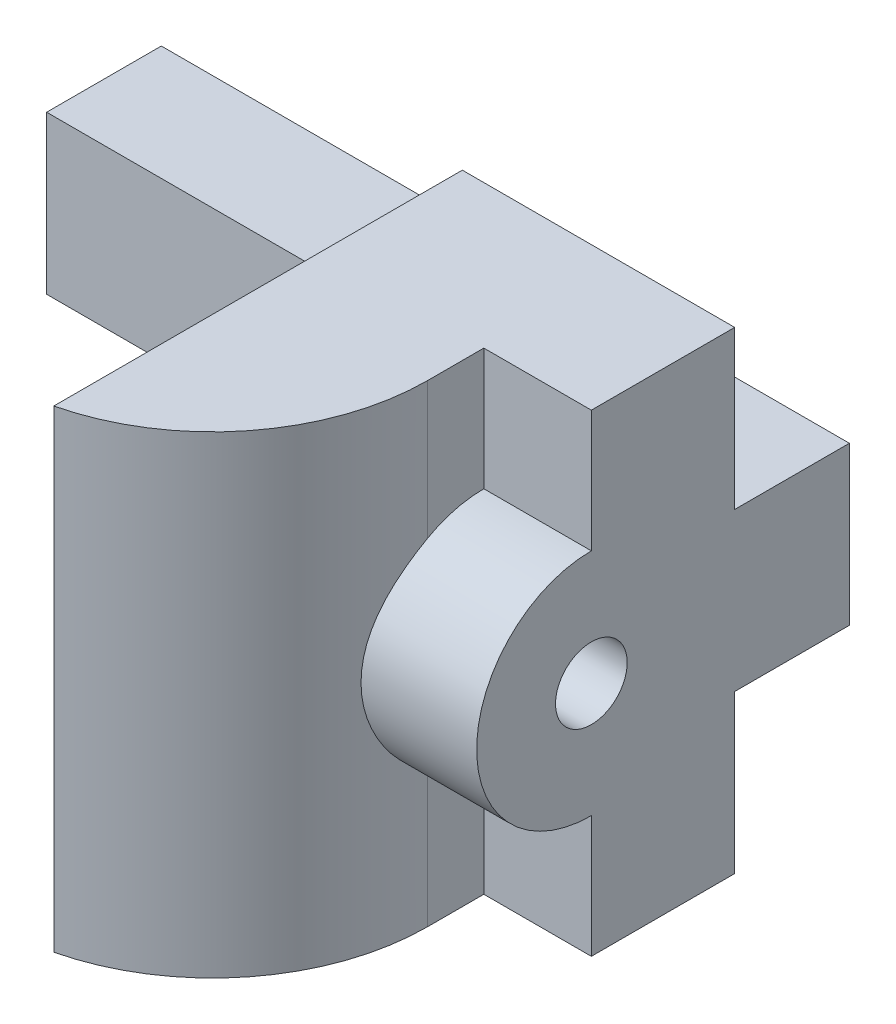
ISO-10303-21;
HEADER;
FILE_DESCRIPTION(('STEP AP214'),'2;1');
FILE_NAME('part.step','',(''),(''),'','','');
FILE_SCHEMA(('AUTOMOTIVE_DESIGN { 1 0 10303 214 1 1 1 1 }'));
ENDSEC;
DATA;
#1=APPLICATION_CONTEXT('core data for automotive mechanical design processes');
#2=APPLICATION_PROTOCOL_DEFINITION('international standard','automotive_design',2000,#1);
#3=PRODUCT_CONTEXT('',#1,'mechanical');
#4=PRODUCT('Part','Part','',(#3));
#5=PRODUCT_RELATED_PRODUCT_CATEGORY('part','',(#4));
#6=PRODUCT_DEFINITION_FORMATION('','',#4);
#7=PRODUCT_DEFINITION_CONTEXT('part definition',#1,'design');
#8=PRODUCT_DEFINITION('design','',#6,#7);
#9=PRODUCT_DEFINITION_SHAPE('','',#8);
#10=(LENGTH_UNIT() NAMED_UNIT(*) SI_UNIT(.MILLI.,.METRE.));
#11=(NAMED_UNIT(*) PLANE_ANGLE_UNIT() SI_UNIT($,.RADIAN.));
#12=(NAMED_UNIT(*) SI_UNIT($,.STERADIAN.) SOLID_ANGLE_UNIT());
#13=UNCERTAINTY_MEASURE_WITH_UNIT(LENGTH_MEASURE(1.E-05),#10,'distance_accuracy_value','');
#14=(GEOMETRIC_REPRESENTATION_CONTEXT(3) GLOBAL_UNCERTAINTY_ASSIGNED_CONTEXT((#13)) GLOBAL_UNIT_ASSIGNED_CONTEXT((#10,
#11,#12)) REPRESENTATION_CONTEXT('',''));
#15=CARTESIAN_POINT('',(0.,0.,0.));
#16=DIRECTION('',(0.,0.,1.));
#17=DIRECTION('',(1.,0.,0.));
#18=AXIS2_PLACEMENT_3D('',#15,#16,#17);
#19=CARTESIAN_POINT('',(-15.,-33.,37.));
#20=DIRECTION('',(1.,0.,0.));
#21=DIRECTION('',(0.,0.,-1.));
#22=AXIS2_PLACEMENT_3D('',#19,#20,#21);
#23=PLANE('',#22);
#24=DIRECTION('',(0.,0.,-1.));
#25=VECTOR('',#24,1.);
#26=CARTESIAN_POINT('',(-15.,33.,37.));
#27=LINE('',#26,#25);
#28=CARTESIAN_POINT('',(-15.,33.,7.82809570837035));
#29=VERTEX_POINT('',#28);
#30=CARTESIAN_POINT('',(-15.,33.,0.));
#31=VERTEX_POINT('',#30);
#32=EDGE_CURVE('E187',#29,#31,#27,.T.);
#33=ORIENTED_EDGE('',*,*,#32,.F.);
#34=DIRECTION('',(0.,1.,0.));
#35=VECTOR('',#34,1.);
#36=CARTESIAN_POINT('',(-15.,-33.,7.82809570837034));
#37=LINE('',#36,#35);
#38=CARTESIAN_POINT('',(-15.,13.9542437122402,7.82809570837034));
#39=VERTEX_POINT('',#38);
#40=EDGE_CURVE('E70',#29,#39,#37,.F.);
#41=ORIENTED_EDGE('',*,*,#40,.T.);
#42=CARTESIAN_POINT('',(-15.,0.,0.));
#43=DIRECTION('',(1.,0.,0.));
#44=DIRECTION('',(0.,0.,-1.));
#45=AXIS2_PLACEMENT_3D('',#42,#43,#44);
#46=CIRCLE('',#45,16.);
#47=CARTESIAN_POINT('',(-15.,16.,0.));
#48=VERTEX_POINT('',#47);
#49=EDGE_CURVE('E228',#48,#39,#46,.T.);
#50=ORIENTED_EDGE('',*,*,#49,.F.);
#51=DIRECTION('',(0.,1.,0.));
#52=VECTOR('',#51,1.);
#53=CARTESIAN_POINT('',(-15.,0.,0.));
#54=LINE('',#53,#52);
#55=EDGE_CURVE('E223',#48,#31,#54,.T.);
#56=ORIENTED_EDGE('',*,*,#55,.T.);
#57=EDGE_LOOP('',(#33,#41,#50,#56));
#58=FACE_BOUND('',#57,.T.);
#59=ADVANCED_FACE('F43',(#58),#23,.T.);
#60=CARTESIAN_POINT('',(-15.,0.,-20.));
#61=DIRECTION('',(0.,0.,1.));
#62=DIRECTION('',(1.,0.,0.));
#63=AXIS2_PLACEMENT_3D('',#60,#61,#62);
#64=PLANE('',#63);
#65=DIRECTION('',(1.,0.,0.));
#66=VECTOR('',#65,1.);
#67=CARTESIAN_POINT('',(-96.,11.,-20.));
#68=LINE('',#67,#66);
#69=CARTESIAN_POINT('',(-38.,11.,-20.));
#70=VERTEX_POINT('',#69);
#71=CARTESIAN_POINT('',(0.,11.,-20.));
#72=VERTEX_POINT('',#71);
#73=EDGE_CURVE('E215',#70,#72,#68,.T.);
#74=ORIENTED_EDGE('',*,*,#73,.F.);
#75=DIRECTION('',(0.,1.,0.));
#76=VECTOR('',#75,1.);
#77=CARTESIAN_POINT('',(-38.,-33.,-20.));
#78=LINE('',#77,#76);
#79=CARTESIAN_POINT('',(-38.,33.,-20.));
#80=VERTEX_POINT('',#79);
#81=EDGE_CURVE('E176',#70,#80,#78,.T.);
#82=ORIENTED_EDGE('',*,*,#81,.T.);
#83=DIRECTION('',(1.,0.,0.));
#84=VECTOR('',#83,1.);
#85=CARTESIAN_POINT('',(-15.,33.,-20.));
#86=LINE('',#85,#84);
#87=CARTESIAN_POINT('',(0.,33.,-20.));
#88=VERTEX_POINT('',#87);
#89=EDGE_CURVE('E160',#80,#88,#86,.T.);
#90=ORIENTED_EDGE('',*,*,#89,.T.);
#91=DIRECTION('',(0.,-1.,0.));
#92=VECTOR('',#91,1.);
#93=CARTESIAN_POINT('',(0.,0.,-20.));
#94=LINE('',#93,#92);
#95=EDGE_CURVE('E247',#88,#72,#94,.T.);
#96=ORIENTED_EDGE('',*,*,#95,.T.);
#97=EDGE_LOOP('',(#74,#82,#90,#96));
#98=FACE_BOUND('',#97,.T.);
#99=ADVANCED_FACE('F275',(#98),#64,.F.);
#100=CARTESIAN_POINT('',(-15.,0.,0.));
#101=DIRECTION('',(0.,0.,-1.));
#102=DIRECTION('',(0.,1.,0.));
#103=AXIS2_PLACEMENT_3D('',#100,#101,#102);
#104=PLANE('',#103);
#105=DIRECTION('',(0.,1.,0.));
#106=VECTOR('',#105,1.);
#107=CARTESIAN_POINT('',(0.,0.,0.));
#108=LINE('',#107,#106);
#109=CARTESIAN_POINT('',(0.,16.,0.));
#110=VERTEX_POINT('',#109);
#111=CARTESIAN_POINT('',(0.,33.,0.));
#112=VERTEX_POINT('',#111);
#113=EDGE_CURVE('E236',#110,#112,#108,.T.);
#114=ORIENTED_EDGE('',*,*,#113,.T.);
#115=DIRECTION('',(1.,0.,0.));
#116=VECTOR('',#115,1.);
#117=CARTESIAN_POINT('',(-15.,33.,0.));
#118=LINE('',#117,#116);
#119=EDGE_CURVE('E252',#31,#112,#118,.T.);
#120=ORIENTED_EDGE('',*,*,#119,.F.);
#121=ORIENTED_EDGE('',*,*,#55,.F.);
#122=DIRECTION('',(1.,0.,0.));
#123=VECTOR('',#122,1.);
#124=CARTESIAN_POINT('',(-15.,16.,0.));
#125=LINE('',#124,#123);
#126=EDGE_CURVE('E233',#48,#110,#125,.T.);
#127=ORIENTED_EDGE('',*,*,#126,.T.);
#128=EDGE_LOOP('',(#114,#120,#121,#127));
#129=FACE_BOUND('',#128,.T.);
#130=ADVANCED_FACE('F306',(#129),#104,.F.);
#131=CARTESIAN_POINT('',(-15.,33.,0.));
#132=DIRECTION('',(0.,1.,0.));
#133=DIRECTION('',(0.,0.,1.));
#134=AXIS2_PLACEMENT_3D('',#131,#132,#133);
#135=PLANE('',#134);
#136=DIRECTION('',(0.,0.,1.));
#137=VECTOR('',#136,1.);
#138=CARTESIAN_POINT('',(-38.,33.,37.));
#139=LINE('',#138,#137);
#140=CARTESIAN_POINT('',(-38.,33.,37.));
#141=VERTEX_POINT('',#140);
#142=EDGE_CURVE('E183',#80,#141,#139,.T.);
#143=ORIENTED_EDGE('',*,*,#142,.T.);
#144=CARTESIAN_POINT('',(-45.,33.,7.82809570837034));
#145=DIRECTION('',(0.,1.,0.));
#146=DIRECTION('',(0.,0.,1.));
#147=AXIS2_PLACEMENT_3D('',#144,#145,#146);
#148=CIRCLE('',#147,30.);
#149=EDGE_CURVE('E260',#141,#29,#148,.T.);
#150=ORIENTED_EDGE('',*,*,#149,.T.);
#151=ORIENTED_EDGE('',*,*,#32,.T.);
#152=ORIENTED_EDGE('',*,*,#119,.T.);
#153=DIRECTION('',(0.,0.,1.));
#154=VECTOR('',#153,1.);
#155=CARTESIAN_POINT('',(0.,33.,0.));
#156=LINE('',#155,#154);
#157=EDGE_CURVE('E227',#88,#112,#156,.T.);
#158=ORIENTED_EDGE('',*,*,#157,.F.);
#159=ORIENTED_EDGE('',*,*,#89,.F.);
#160=EDGE_LOOP('',(#143,#150,#151,#152,#158,#159));
#161=FACE_BOUND('',#160,.T.);
#162=ADVANCED_FACE('F271',(#161),#135,.T.);
#163=DIRECTION('',(1.,0.,0.));
#164=VECTOR('',#163,1.);
#165=CARTESIAN_POINT('',(-15.,-33.,-20.));
#166=LINE('',#165,#164);
#167=CARTESIAN_POINT('',(-38.,-33.,-20.));
#168=VERTEX_POINT('',#167);
#169=CARTESIAN_POINT('',(0.,-33.,-20.));
#170=VERTEX_POINT('',#169);
#171=EDGE_CURVE('E150',#168,#170,#166,.T.);
#172=ORIENTED_EDGE('',*,*,#171,.F.);
#173=CARTESIAN_POINT('',(-38.,-11.,-20.));
#174=VERTEX_POINT('',#173);
#175=EDGE_CURVE('E154',#168,#174,#78,.T.);
#176=ORIENTED_EDGE('',*,*,#175,.T.);
#177=DIRECTION('',(1.,0.,0.));
#178=VECTOR('',#177,1.);
#179=CARTESIAN_POINT('',(-96.,-11.,-20.));
#180=LINE('',#179,#178);
#181=CARTESIAN_POINT('',(0.,-11.,-20.));
#182=VERTEX_POINT('',#181);
#183=EDGE_CURVE('E222',#174,#182,#180,.T.);
#184=ORIENTED_EDGE('',*,*,#183,.T.);
#185=EDGE_CURVE('E156',#182,#170,#94,.T.);
#186=ORIENTED_EDGE('',*,*,#185,.T.);
#187=EDGE_LOOP('',(#172,#176,#184,#186));
#188=FACE_BOUND('',#187,.T.);
#189=ADVANCED_FACE('F152',(#188),#64,.F.);
#190=CARTESIAN_POINT('',(-15.,-33.,0.));
#191=DIRECTION('',(0.,1.,0.));
#192=DIRECTION('',(0.,0.,1.));
#193=AXIS2_PLACEMENT_3D('',#190,#191,#192);
#194=PLANE('',#193);
#195=DIRECTION('',(0.,0.,-1.));
#196=VECTOR('',#195,1.);
#197=CARTESIAN_POINT('',(-15.,-33.,37.));
#198=LINE('',#197,#196);
#199=CARTESIAN_POINT('',(-15.,-33.,7.82809570837034));
#200=VERTEX_POINT('',#199);
#201=CARTESIAN_POINT('',(-15.,-33.,0.));
#202=VERTEX_POINT('',#201);
#203=EDGE_CURVE('E180',#200,#202,#198,.T.);
#204=ORIENTED_EDGE('',*,*,#203,.F.);
#205=CARTESIAN_POINT('',(-45.,-33.,7.82809570837034));
#206=DIRECTION('',(0.,1.,0.));
#207=DIRECTION('',(0.,0.,1.));
#208=AXIS2_PLACEMENT_3D('',#205,#206,#207);
#209=CIRCLE('',#208,30.);
#210=CARTESIAN_POINT('',(-38.,-33.,37.));
#211=VERTEX_POINT('',#210);
#212=EDGE_CURVE('E57',#200,#211,#209,.F.);
#213=ORIENTED_EDGE('',*,*,#212,.T.);
#214=DIRECTION('',(0.,0.,1.));
#215=VECTOR('',#214,1.);
#216=CARTESIAN_POINT('',(-38.,-33.,37.));
#217=LINE('',#216,#215);
#218=EDGE_CURVE('E169',#168,#211,#217,.T.);
#219=ORIENTED_EDGE('',*,*,#218,.F.);
#220=ORIENTED_EDGE('',*,*,#171,.T.);
#221=DIRECTION('',(0.,0.,1.));
#222=VECTOR('',#221,1.);
#223=CARTESIAN_POINT('',(0.,-33.,0.));
#224=LINE('',#223,#222);
#225=CARTESIAN_POINT('',(0.,-33.,0.));
#226=VERTEX_POINT('',#225);
#227=EDGE_CURVE('E245',#170,#226,#224,.T.);
#228=ORIENTED_EDGE('',*,*,#227,.T.);
#229=DIRECTION('',(1.,0.,0.));
#230=VECTOR('',#229,1.);
#231=CARTESIAN_POINT('',(-15.,-33.,0.));
#232=LINE('',#231,#230);
#233=EDGE_CURVE('E161',#202,#226,#232,.T.);
#234=ORIENTED_EDGE('',*,*,#233,.F.);
#235=EDGE_LOOP('',(#204,#213,#219,#220,#228,#234));
#236=FACE_BOUND('',#235,.T.);
#237=ADVANCED_FACE('F178',(#236),#194,.F.);
#238=CARTESIAN_POINT('',(-15.,0.,0.));
#239=DIRECTION('',(0.,0.,-1.));
#240=DIRECTION('',(0.,1.,0.));
#241=AXIS2_PLACEMENT_3D('',#238,#239,#240);
#242=PLANE('',#241);
#243=DIRECTION('',(0.,1.,0.));
#244=VECTOR('',#243,1.);
#245=CARTESIAN_POINT('',(0.,0.,0.));
#246=LINE('',#245,#244);
#247=CARTESIAN_POINT('',(0.,-16.,0.));
#248=VERTEX_POINT('',#247);
#249=EDGE_CURVE('E242',#226,#248,#246,.T.);
#250=ORIENTED_EDGE('',*,*,#249,.T.);
#251=DIRECTION('',(1.,0.,0.));
#252=VECTOR('',#251,1.);
#253=CARTESIAN_POINT('',(-15.,-16.,0.));
#254=LINE('',#253,#252);
#255=CARTESIAN_POINT('',(-15.,-16.,0.));
#256=VERTEX_POINT('',#255);
#257=EDGE_CURVE('E257',#256,#248,#254,.T.);
#258=ORIENTED_EDGE('',*,*,#257,.F.);
#259=DIRECTION('',(0.,1.,0.));
#260=VECTOR('',#259,1.);
#261=CARTESIAN_POINT('',(-15.,0.,0.));
#262=LINE('',#261,#260);
#263=EDGE_CURVE('E230',#202,#256,#262,.T.);
#264=ORIENTED_EDGE('',*,*,#263,.F.);
#265=ORIENTED_EDGE('',*,*,#233,.T.);
#266=EDGE_LOOP('',(#250,#258,#264,#265));
#267=FACE_BOUND('',#266,.T.);
#268=ADVANCED_FACE('F299',(#267),#242,.F.);
#269=CARTESIAN_POINT('',(-15.,0.,0.));
#270=DIRECTION('',(1.,0.,0.));
#271=DIRECTION('',(0.,0.,-1.));
#272=AXIS2_PLACEMENT_3D('',#269,#270,#271);
#273=CYLINDRICAL_SURFACE('',#272,5.);
#274=CARTESIAN_POINT('',(0.,0.,0.));
#275=DIRECTION('',(1.,0.,0.));
#276=DIRECTION('',(0.,0.,-1.));
#277=AXIS2_PLACEMENT_3D('',#274,#275,#276);
#278=CIRCLE('',#277,5.);
#279=CARTESIAN_POINT('',(0.,0.,-5.));
#280=VERTEX_POINT('',#279);
#281=EDGE_CURVE('E213',#280,#280,#278,.T.);
#282=ORIENTED_EDGE('',*,*,#281,.T.);
#283=EDGE_LOOP('',(#282));
#284=FACE_BOUND('',#283,.T.);
#285=CARTESIAN_POINT('',(-38.,0.,0.));
#286=DIRECTION('',(-1.,0.,0.));
#287=DIRECTION('',(0.,0.,1.));
#288=AXIS2_PLACEMENT_3D('',#285,#286,#287);
#289=CIRCLE('',#288,5.);
#290=CARTESIAN_POINT('',(-38.,0.,5.));
#291=VERTEX_POINT('',#290);
#292=EDGE_CURVE('E189',#291,#291,#289,.T.);
#293=ORIENTED_EDGE('',*,*,#292,.T.);
#294=EDGE_LOOP('',(#293));
#295=FACE_BOUND('',#294,.T.);
#296=ADVANCED_FACE('F331',(#284,#295),#273,.F.);
#297=CARTESIAN_POINT('',(-15.,0.,0.));
#298=DIRECTION('',(1.,0.,0.));
#299=DIRECTION('',(0.,0.,-1.));
#300=AXIS2_PLACEMENT_3D('',#297,#298,#299);
#301=CYLINDRICAL_SURFACE('',#300,16.);
#302=CARTESIAN_POINT('',(0.,0.,0.));
#303=DIRECTION('',(1.,0.,0.));
#304=DIRECTION('',(0.,0.,-1.));
#305=AXIS2_PLACEMENT_3D('',#302,#303,#304);
#306=CIRCLE('',#305,16.);
#307=EDGE_CURVE('E239',#110,#248,#306,.T.);
#308=ORIENTED_EDGE('',*,*,#307,.F.);
#309=ORIENTED_EDGE('',*,*,#126,.F.);
#310=ORIENTED_EDGE('',*,*,#49,.T.);
#311=CARTESIAN_POINT('',(-15.,13.9542437122402,7.82809570837034));
#312=CARTESIAN_POINT('',(-14.9999984707289,13.8458238511641,8.02136495368062));
#313=CARTESIAN_POINT('',(-15.0018680134799,13.733402796322,8.21235183654159));
#314=CARTESIAN_POINT('',(-15.0090695703628,13.500765744661,8.58943568386215));
#315=CARTESIAN_POINT('',(-15.014401375906,13.3805502178233,8.77553294220114));
#316=CARTESIAN_POINT('',(-15.0351616882772,13.008671163494,9.32578786089453));
#317=CARTESIAN_POINT('',(-15.0553558509831,12.7456273641378,9.68217199285267));
#318=CARTESIAN_POINT('',(-15.1059511827228,12.1919389820572,10.3707027430823));
#319=CARTESIAN_POINT('',(-15.1363311087452,11.9013527380745,10.7028980678195));
#320=CARTESIAN_POINT('',(-15.2047462321411,11.2941539129909,11.3417945178719));
#321=CARTESIAN_POINT('',(-15.2427821993743,10.977538716422,11.6484930749516));
#322=CARTESIAN_POINT('',(-15.3238394499886,10.3208690446969,12.2340911041424));
#323=CARTESIAN_POINT('',(-15.3668547053921,9.98084310887267,12.5130234446041));
#324=CARTESIAN_POINT('',(-15.4553066944847,9.27921143915049,13.0418253870234));
#325=CARTESIAN_POINT('',(-15.5007433728901,8.91760619790962,13.2916956520866));
#326=CARTESIAN_POINT('',(-15.5915259734509,8.17491045641195,13.7609543928187));
#327=CARTESIAN_POINT('',(-15.6368718511583,7.79381208802574,13.9803304249604));
#328=CARTESIAN_POINT('',(-15.7250457999588,7.01461651305621,14.3870882515202));
#329=CARTESIAN_POINT('',(-15.7678738232731,6.61651898414383,14.5744694389321));
#330=CARTESIAN_POINT('',(-15.8499283735667,5.79442469512369,14.9207611709347));
#331=CARTESIAN_POINT('',(-15.8890199066429,5.37001452342851,15.0787238984434));
#332=CARTESIAN_POINT('',(-15.9600695824115,4.50877403780745,15.358252570357));
#333=CARTESIAN_POINT('',(-15.9920276053099,4.07194351544385,15.4798179035474));
#334=CARTESIAN_POINT('',(-16.0470627450896,3.18912142650823,15.6854983298854));
#335=CARTESIAN_POINT('',(-16.0701423387051,2.74313245140836,15.7696238682984));
#336=CARTESIAN_POINT('',(-16.1061677167384,1.84522189473494,15.8997146848741));
#337=CARTESIAN_POINT('',(-16.1191138524598,1.39330051937631,15.9456812859223));
#338=CARTESIAN_POINT('',(-16.1339474240853,0.499909647277765,15.9982683985053));
#339=CARTESIAN_POINT('',(-16.1361390236977,0.0585086139067362,16.0059711802765));
#340=CARTESIAN_POINT('',(-16.1301736423245,-0.823345933395908,15.9848872620183));
#341=CARTESIAN_POINT('',(-16.1220168311207,-1.26379946275405,15.9561011606461));
#342=CARTESIAN_POINT('',(-16.0957806016024,-2.14050128433078,15.8623013200419));
#343=CARTESIAN_POINT('',(-16.0777017264195,-2.57674980540061,15.7972895637911));
#344=CARTESIAN_POINT('',(-16.0325594388389,-3.44194109161932,15.6316041470315));
#345=CARTESIAN_POINT('',(-16.0054960103089,-3.87088384364882,15.5309304224897));
#346=CARTESIAN_POINT('',(-15.9442008902673,-4.71270873934569,15.2963622585319));
#347=CARTESIAN_POINT('',(-15.9100720686125,-5.12573017792261,15.1629399511382));
#348=CARTESIAN_POINT('',(-15.8361331881991,-5.93912261824279,14.8631992045905));
#349=CARTESIAN_POINT('',(-15.7963231524188,-6.33949367114434,14.6968808984879));
#350=CARTESIAN_POINT('',(-15.7129841642075,-7.12535938497216,14.332375589738));
#351=CARTESIAN_POINT('',(-15.669452857653,-7.51084440161166,14.1341683427641));
#352=CARTESIAN_POINT('',(-15.580903184057,-8.26433817599383,13.707232747038));
#353=CARTESIAN_POINT('',(-15.535884815973,-8.63234692148408,13.4785043768881));
#354=CARTESIAN_POINT('',(-15.4450708499839,-9.36194868142332,12.9828935805831));
#355=CARTESIAN_POINT('',(-15.3993081512006,-9.72280016103391,12.7149123634815));
#356=CARTESIAN_POINT('',(-15.3114664468623,-10.4209499725334,12.149305511944));
#357=CARTESIAN_POINT('',(-15.2693873792038,-10.7582487014856,11.8516803774645));
#358=CARTESIAN_POINT('',(-15.1917641852138,-11.4064631222209,11.2291677496947));
#359=CARTESIAN_POINT('',(-15.1562098107414,-11.7174197678152,10.9043241971919));
#360=CARTESIAN_POINT('',(-15.09432730019,-12.3111504495216,10.2292465709672));
#361=CARTESIAN_POINT('',(-15.0679943623297,-12.5939390981977,9.87902582665631));
#362=CARTESIAN_POINT('',(-15.032386010178,-13.0611654930808,9.24762314238053));
#363=CARTESIAN_POINT('',(-15.0204756434194,-13.2523246759277,8.97153691769578));
#364=CARTESIAN_POINT('',(-15.0042807258008,-13.6167907375265,8.4080671269403));
#365=CARTESIAN_POINT('',(-14.9999873493714,-13.7901180577594,8.12069703045202));
#366=CARTESIAN_POINT('',(-15.,-13.9542437122402,7.82809570837034));
#367=B_SPLINE_CURVE_WITH_KNOTS('',3,(#311,#312,#313,#314,#315,#316,#317,#318,#319,#320,#321,
#322,#323,#324,#325,#326,#327,#328,#329,#330,#331,#332,#333,#334,#335,#336,#337,#338,#339,#340,
#341,#342,#343,#344,#345,#346,#347,#348,#349,#350,#351,#352,#353,#354,#355,#356,#357,#358,#359,
#360,#361,#362,#363,#364,#365,#366),.UNSPECIFIED.,.F.,.F.,(4,2,2,2,2,2,2,2,2,2,2,2,2,2,2,2,2,2,
2,2,2,2,2,2,2,2,2,4),(0.,0.664690059223715,1.32934007700383,2.65773739085605,3.98338131062384,
5.30915859830797,6.63334734900669,7.95750587993959,9.28220317286547,10.6069255951612,
11.9688670776813,13.3308314297453,14.6924155711058,16.0539525074016,17.3767507719833,
18.6995273342689,20.0222314952872,21.3449380313093,22.6495928781606,23.9542424482969,
25.259723552234,26.5652055714159,27.9190039571072,29.2727795143229,30.6244101893403,
31.9753359937345,32.9826713823565,33.9888388386991),.UNSPECIFIED.);
#368=CARTESIAN_POINT('',(-15.,-13.9542437122402,7.82809570837034));
#369=VERTEX_POINT('',#368);
#370=EDGE_CURVE('E11',#39,#369,#367,.T.);
#371=ORIENTED_EDGE('',*,*,#370,.T.);
#372=EDGE_CURVE('E226',#369,#256,#46,.T.);
#373=ORIENTED_EDGE('',*,*,#372,.T.);
#374=ORIENTED_EDGE('',*,*,#257,.T.);
#375=EDGE_LOOP('',(#308,#309,#310,#371,#373,#374));
#376=FACE_BOUND('',#375,.T.);
#377=ADVANCED_FACE('F302',(#376),#301,.T.);
#378=CARTESIAN_POINT('',(0.,0.,0.));
#379=DIRECTION('',(1.,0.,0.));
#380=DIRECTION('',(0.,0.,-1.));
#381=AXIS2_PLACEMENT_3D('',#378,#379,#380);
#382=PLANE('',#381);
#383=ORIENTED_EDGE('',*,*,#281,.F.);
#384=EDGE_LOOP('',(#383));
#385=FACE_BOUND('',#384,.T.);
#386=ORIENTED_EDGE('',*,*,#113,.F.);
#387=ORIENTED_EDGE('',*,*,#307,.T.);
#388=ORIENTED_EDGE('',*,*,#249,.F.);
#389=ORIENTED_EDGE('',*,*,#227,.F.);
#390=ORIENTED_EDGE('',*,*,#185,.F.);
#391=DIRECTION('',(0.,0.,1.));
#392=VECTOR('',#391,1.);
#393=CARTESIAN_POINT('',(0.,-11.,0.));
#394=LINE('',#393,#392);
#395=CARTESIAN_POINT('',(0.,-11.,-36.));
#396=VERTEX_POINT('',#395);
#397=EDGE_CURVE('E192',#396,#182,#394,.T.);
#398=ORIENTED_EDGE('',*,*,#397,.F.);
#399=DIRECTION('',(0.,-1.,0.));
#400=VECTOR('',#399,1.);
#401=CARTESIAN_POINT('',(0.,0.,-36.));
#402=LINE('',#401,#400);
#403=CARTESIAN_POINT('',(0.,11.,-36.));
#404=VERTEX_POINT('',#403);
#405=EDGE_CURVE('E206',#404,#396,#402,.T.);
#406=ORIENTED_EDGE('',*,*,#405,.F.);
#407=DIRECTION('',(0.,0.,1.));
#408=VECTOR('',#407,1.);
#409=CARTESIAN_POINT('',(0.,11.,0.));
#410=LINE('',#409,#408);
#411=EDGE_CURVE('E197',#404,#72,#410,.T.);
#412=ORIENTED_EDGE('',*,*,#411,.T.);
#413=ORIENTED_EDGE('',*,*,#95,.F.);
#414=ORIENTED_EDGE('',*,*,#157,.T.);
#415=EDGE_LOOP('',(#386,#387,#388,#389,#390,#398,#406,#412,#413,#414));
#416=FACE_BOUND('',#415,.T.);
#417=ADVANCED_FACE('F295',(#385,#416),#382,.T.);
#418=CARTESIAN_POINT('',(-96.,0.,-20.));
#419=DIRECTION('',(0.,0.,-1.));
#420=DIRECTION('',(-1.,0.,0.));
#421=AXIS2_PLACEMENT_3D('',#418,#419,#420);
#422=PLANE('',#421);
#423=CARTESIAN_POINT('',(-96.,-11.,-20.));
#424=VERTEX_POINT('',#423);
#425=EDGE_CURVE('E204',#424,#174,#180,.T.);
#426=ORIENTED_EDGE('',*,*,#425,.T.);
#427=EDGE_CURVE('E173',#174,#70,#78,.T.);
#428=ORIENTED_EDGE('',*,*,#427,.T.);
#429=CARTESIAN_POINT('',(-96.,11.,-20.));
#430=VERTEX_POINT('',#429);
#431=EDGE_CURVE('E210',#430,#70,#68,.T.);
#432=ORIENTED_EDGE('',*,*,#431,.F.);
#433=DIRECTION('',(0.,1.,0.));
#434=VECTOR('',#433,1.);
#435=CARTESIAN_POINT('',(-96.,0.,-20.));
#436=LINE('',#435,#434);
#437=EDGE_CURVE('E194',#424,#430,#436,.T.);
#438=ORIENTED_EDGE('',*,*,#437,.F.);
#439=EDGE_LOOP('',(#426,#428,#432,#438));
#440=FACE_BOUND('',#439,.T.);
#441=ADVANCED_FACE('F280',(#440),#422,.F.);
#442=CARTESIAN_POINT('',(-96.,11.,0.));
#443=DIRECTION('',(0.,1.,0.));
#444=DIRECTION('',(0.,0.,1.));
#445=AXIS2_PLACEMENT_3D('',#442,#443,#444);
#446=PLANE('',#445);
#447=ORIENTED_EDGE('',*,*,#411,.F.);
#448=DIRECTION('',(1.,0.,0.));
#449=VECTOR('',#448,1.);
#450=CARTESIAN_POINT('',(-96.,11.,-36.));
#451=LINE('',#450,#449);
#452=CARTESIAN_POINT('',(-96.,11.,-36.));
#453=VERTEX_POINT('',#452);
#454=EDGE_CURVE('E214',#453,#404,#451,.T.);
#455=ORIENTED_EDGE('',*,*,#454,.F.);
#456=DIRECTION('',(0.,0.,1.));
#457=VECTOR('',#456,1.);
#458=CARTESIAN_POINT('',(-96.,11.,0.));
#459=LINE('',#458,#457);
#460=EDGE_CURVE('E201',#453,#430,#459,.T.);
#461=ORIENTED_EDGE('',*,*,#460,.T.);
#462=ORIENTED_EDGE('',*,*,#431,.T.);
#463=ORIENTED_EDGE('',*,*,#73,.T.);
#464=EDGE_LOOP('',(#447,#455,#461,#462,#463));
#465=FACE_BOUND('',#464,.T.);
#466=ADVANCED_FACE('F283',(#465),#446,.T.);
#467=CARTESIAN_POINT('',(-96.,0.,-36.));
#468=DIRECTION('',(0.,0.,1.));
#469=DIRECTION('',(1.,0.,0.));
#470=AXIS2_PLACEMENT_3D('',#467,#468,#469);
#471=PLANE('',#470);
#472=ORIENTED_EDGE('',*,*,#405,.T.);
#473=DIRECTION('',(1.,0.,0.));
#474=VECTOR('',#473,1.);
#475=CARTESIAN_POINT('',(-96.,-11.,-36.));
#476=LINE('',#475,#474);
#477=CARTESIAN_POINT('',(-96.,-11.,-36.));
#478=VERTEX_POINT('',#477);
#479=EDGE_CURVE('E217',#478,#396,#476,.T.);
#480=ORIENTED_EDGE('',*,*,#479,.F.);
#481=DIRECTION('',(0.,-1.,0.));
#482=VECTOR('',#481,1.);
#483=CARTESIAN_POINT('',(-96.,0.,-36.));
#484=LINE('',#483,#482);
#485=EDGE_CURVE('E199',#453,#478,#484,.T.);
#486=ORIENTED_EDGE('',*,*,#485,.F.);
#487=ORIENTED_EDGE('',*,*,#454,.T.);
#488=EDGE_LOOP('',(#472,#480,#486,#487));
#489=FACE_BOUND('',#488,.T.);
#490=ADVANCED_FACE('F351',(#489),#471,.F.);
#491=CARTESIAN_POINT('',(-96.,-11.,0.));
#492=DIRECTION('',(0.,1.,0.));
#493=DIRECTION('',(0.,0.,1.));
#494=AXIS2_PLACEMENT_3D('',#491,#492,#493);
#495=PLANE('',#494);
#496=ORIENTED_EDGE('',*,*,#397,.T.);
#497=ORIENTED_EDGE('',*,*,#183,.F.);
#498=ORIENTED_EDGE('',*,*,#425,.F.);
#499=DIRECTION('',(0.,0.,1.));
#500=VECTOR('',#499,1.);
#501=CARTESIAN_POINT('',(-96.,-11.,0.));
#502=LINE('',#501,#500);
#503=EDGE_CURVE('E196',#478,#424,#502,.T.);
#504=ORIENTED_EDGE('',*,*,#503,.F.);
#505=ORIENTED_EDGE('',*,*,#479,.T.);
#506=EDGE_LOOP('',(#496,#497,#498,#504,#505));
#507=FACE_BOUND('',#506,.T.);
#508=ADVANCED_FACE('F291',(#507),#495,.F.);
#509=CARTESIAN_POINT('',(-96.,0.,0.));
#510=DIRECTION('',(1.,0.,0.));
#511=DIRECTION('',(0.,0.,-1.));
#512=AXIS2_PLACEMENT_3D('',#509,#510,#511);
#513=PLANE('',#512);
#514=ORIENTED_EDGE('',*,*,#437,.T.);
#515=ORIENTED_EDGE('',*,*,#460,.F.);
#516=ORIENTED_EDGE('',*,*,#485,.T.);
#517=ORIENTED_EDGE('',*,*,#503,.T.);
#518=EDGE_LOOP('',(#514,#515,#516,#517));
#519=FACE_BOUND('',#518,.T.);
#520=ADVANCED_FACE('F287',(#519),#513,.F.);
#521=CARTESIAN_POINT('',(-38.,-33.,37.));
#522=DIRECTION('',(-1.,0.,0.));
#523=DIRECTION('',(0.,0.,1.));
#524=AXIS2_PLACEMENT_3D('',#521,#522,#523);
#525=PLANE('',#524);
#526=ORIENTED_EDGE('',*,*,#292,.F.);
#527=EDGE_LOOP('',(#526));
#528=FACE_BOUND('',#527,.T.);
#529=ORIENTED_EDGE('',*,*,#142,.F.);
#530=ORIENTED_EDGE('',*,*,#81,.F.);
#531=ORIENTED_EDGE('',*,*,#427,.F.);
#532=ORIENTED_EDGE('',*,*,#175,.F.);
#533=ORIENTED_EDGE('',*,*,#218,.T.);
#534=DIRECTION('',(0.,1.,0.));
#535=VECTOR('',#534,1.);
#536=CARTESIAN_POINT('',(-38.,-33.,37.));
#537=LINE('',#536,#535);
#538=EDGE_CURVE('E174',#211,#141,#537,.T.);
#539=ORIENTED_EDGE('',*,*,#538,.T.);
#540=EDGE_LOOP('',(#529,#530,#531,#532,#533,#539));
#541=FACE_BOUND('',#540,.T.);
#542=ADVANCED_FACE('F167',(#528,#541),#525,.T.);
#543=ORIENTED_EDGE('',*,*,#372,.F.);
#544=DIRECTION('',(0.,1.,0.));
#545=VECTOR('',#544,1.);
#546=CARTESIAN_POINT('',(-15.,-33.,7.82809570837034));
#547=LINE('',#546,#545);
#548=EDGE_CURVE('E262',#369,#200,#547,.F.);
#549=ORIENTED_EDGE('',*,*,#548,.T.);
#550=ORIENTED_EDGE('',*,*,#203,.T.);
#551=ORIENTED_EDGE('',*,*,#263,.T.);
#552=EDGE_LOOP('',(#543,#549,#550,#551));
#553=FACE_BOUND('',#552,.T.);
#554=ADVANCED_FACE('F266',(#553),#23,.T.);
#555=CARTESIAN_POINT('',(-45.,-33.,7.82809570837034));
#556=DIRECTION('',(0.,-1.,0.));
#557=DIRECTION('',(0.,0.,-1.));
#558=AXIS2_PLACEMENT_3D('',#555,#556,#557);
#559=CYLINDRICAL_SURFACE('',#558,30.);
#560=ORIENTED_EDGE('',*,*,#370,.F.);
#561=ORIENTED_EDGE('',*,*,#40,.F.);
#562=ORIENTED_EDGE('',*,*,#149,.F.);
#563=ORIENTED_EDGE('',*,*,#538,.F.);
#564=ORIENTED_EDGE('',*,*,#212,.F.);
#565=ORIENTED_EDGE('',*,*,#548,.F.);
#566=EDGE_LOOP('',(#560,#561,#562,#563,#564,#565));
#567=FACE_BOUND('',#566,.T.);
#568=ADVANCED_FACE('F45',(#567),#559,.T.);
#569=CLOSED_SHELL('',(#59,#99,#130,#162,#189,#237,#268,#296,#377,#417,#441,#466,#490,#508,#520,
#542,#554,#568));
#570=MANIFOLD_SOLID_BREP('B2',#569);
#571=ADVANCED_BREP_SHAPE_REPRESENTATION('',(#18,#570),#14);
#572=SHAPE_DEFINITION_REPRESENTATION(#9,#571);
ENDSEC;
END-ISO-10303-21;
